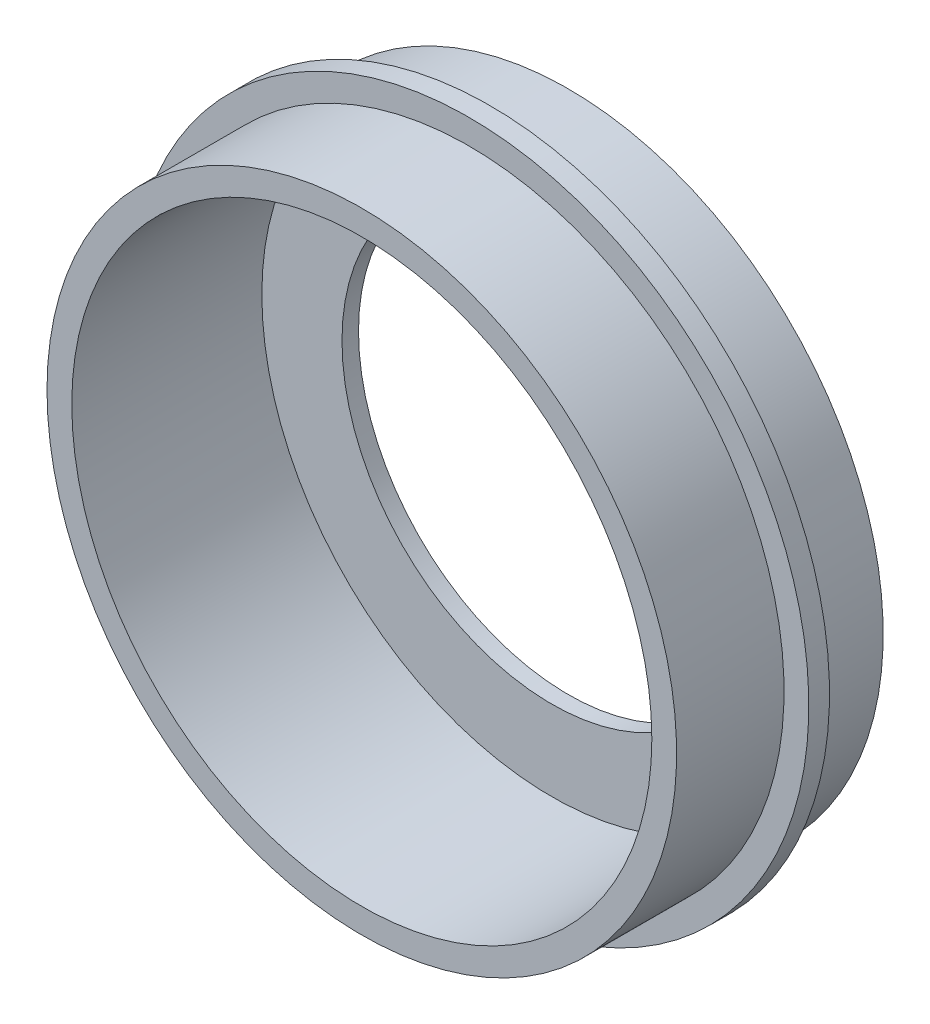
ISO-10303-21;
HEADER;
FILE_DESCRIPTION(('STEP AP214'),'2;1');
FILE_NAME('part.step','',(''),(''),'','','');
FILE_SCHEMA(('AUTOMOTIVE_DESIGN { 1 0 10303 214 1 1 1 1 }'));
ENDSEC;
DATA;
#1=APPLICATION_CONTEXT('core data for automotive mechanical design processes');
#2=APPLICATION_PROTOCOL_DEFINITION('international standard','automotive_design',2000,#1);
#3=PRODUCT_CONTEXT('',#1,'mechanical');
#4=PRODUCT('Part','Part','',(#3));
#5=PRODUCT_RELATED_PRODUCT_CATEGORY('part','',(#4));
#6=PRODUCT_DEFINITION_FORMATION('','',#4);
#7=PRODUCT_DEFINITION_CONTEXT('part definition',#1,'design');
#8=PRODUCT_DEFINITION('design','',#6,#7);
#9=PRODUCT_DEFINITION_SHAPE('','',#8);
#10=(LENGTH_UNIT() NAMED_UNIT(*) SI_UNIT(.MILLI.,.METRE.));
#11=(NAMED_UNIT(*) PLANE_ANGLE_UNIT() SI_UNIT($,.RADIAN.));
#12=(NAMED_UNIT(*) SI_UNIT($,.STERADIAN.) SOLID_ANGLE_UNIT());
#13=UNCERTAINTY_MEASURE_WITH_UNIT(LENGTH_MEASURE(1.E-05),#10,'distance_accuracy_value','');
#14=(GEOMETRIC_REPRESENTATION_CONTEXT(3) GLOBAL_UNCERTAINTY_ASSIGNED_CONTEXT((#13)) GLOBAL_UNIT_ASSIGNED_CONTEXT((#10,
#11,#12)) REPRESENTATION_CONTEXT('',''));
#15=CARTESIAN_POINT('',(0.,0.,0.));
#16=DIRECTION('',(0.,0.,1.));
#17=DIRECTION('',(1.,0.,0.));
#18=AXIS2_PLACEMENT_3D('',#15,#16,#17);
#19=CARTESIAN_POINT('',(0.,0.,0.));
#20=DIRECTION('',(0.,0.,-1.));
#21=DIRECTION('',(-1.,0.,0.));
#22=AXIS2_PLACEMENT_3D('',#19,#20,#21);
#23=CYLINDRICAL_SURFACE('',#22,38.1);
#24=CARTESIAN_POINT('',(0.,0.,25.));
#25=DIRECTION('',(0.,0.,-1.));
#26=DIRECTION('',(-1.,0.,0.));
#27=AXIS2_PLACEMENT_3D('',#24,#25,#26);
#28=CIRCLE('',#27,38.1);
#29=CARTESIAN_POINT('',(-38.1,0.,25.));
#30=VERTEX_POINT('',#29);
#31=EDGE_CURVE('E10',#30,#30,#28,.T.);
#32=ORIENTED_EDGE('',*,*,#31,.T.);
#33=EDGE_LOOP('',(#32));
#34=FACE_BOUND('',#33,.T.);
#35=CARTESIAN_POINT('',(0.,0.,12.));
#36=DIRECTION('',(0.,0.,-1.));
#37=DIRECTION('',(-1.,0.,0.));
#38=AXIS2_PLACEMENT_3D('',#35,#36,#37);
#39=CIRCLE('',#38,38.1);
#40=CARTESIAN_POINT('',(-38.1,0.,12.));
#41=VERTEX_POINT('',#40);
#42=EDGE_CURVE('E84',#41,#41,#39,.T.);
#43=ORIENTED_EDGE('',*,*,#42,.F.);
#44=EDGE_LOOP('',(#43));
#45=FACE_BOUND('',#44,.T.);
#46=ADVANCED_FACE('F41',(#34,#45),#23,.T.);
#47=CARTESIAN_POINT('',(0.,35.1,25.));
#48=DIRECTION('',(0.,0.,1.));
#49=DIRECTION('',(1.,0.,0.));
#50=AXIS2_PLACEMENT_3D('',#47,#48,#49);
#51=PLANE('',#50);
#52=CARTESIAN_POINT('',(0.,0.,25.));
#53=DIRECTION('',(0.,0.,-1.));
#54=DIRECTION('',(-1.,0.,0.));
#55=AXIS2_PLACEMENT_3D('',#52,#53,#54);
#56=CIRCLE('',#55,35.1);
#57=CARTESIAN_POINT('',(-35.1,0.,25.));
#58=VERTEX_POINT('',#57);
#59=EDGE_CURVE('E48',#58,#58,#56,.T.);
#60=ORIENTED_EDGE('',*,*,#59,.T.);
#61=EDGE_LOOP('',(#60));
#62=FACE_BOUND('',#61,.T.);
#63=ORIENTED_EDGE('',*,*,#31,.F.);
#64=EDGE_LOOP('',(#63));
#65=FACE_BOUND('',#64,.T.);
#66=ADVANCED_FACE('F93',(#62,#65),#51,.T.);
#67=CARTESIAN_POINT('',(0.,0.,0.));
#68=DIRECTION('',(0.,0.,-1.));
#69=DIRECTION('',(-1.,0.,0.));
#70=AXIS2_PLACEMENT_3D('',#67,#68,#69);
#71=CYLINDRICAL_SURFACE('',#70,35.1);
#72=CARTESIAN_POINT('',(0.,0.,2.));
#73=DIRECTION('',(0.,0.,-1.));
#74=DIRECTION('',(-1.,0.,0.));
#75=AXIS2_PLACEMENT_3D('',#72,#73,#74);
#76=CIRCLE('',#75,35.1);
#77=CARTESIAN_POINT('',(-35.1,0.,2.));
#78=VERTEX_POINT('',#77);
#79=EDGE_CURVE('E53',#78,#78,#76,.T.);
#80=ORIENTED_EDGE('',*,*,#79,.T.);
#81=EDGE_LOOP('',(#80));
#82=FACE_BOUND('',#81,.T.);
#83=ORIENTED_EDGE('',*,*,#59,.F.);
#84=EDGE_LOOP('',(#83));
#85=FACE_BOUND('',#84,.T.);
#86=ADVANCED_FACE('F97',(#82,#85),#71,.F.);
#87=CARTESIAN_POINT('',(0.,25.4,2.));
#88=DIRECTION('',(0.,0.,1.));
#89=DIRECTION('',(1.,0.,0.));
#90=AXIS2_PLACEMENT_3D('',#87,#88,#89);
#91=PLANE('',#90);
#92=CARTESIAN_POINT('',(0.,0.,2.));
#93=DIRECTION('',(0.,0.,-1.));
#94=DIRECTION('',(-1.,0.,0.));
#95=AXIS2_PLACEMENT_3D('',#92,#93,#94);
#96=CIRCLE('',#95,25.4);
#97=CARTESIAN_POINT('',(-25.4,0.,2.));
#98=VERTEX_POINT('',#97);
#99=EDGE_CURVE('E58',#98,#98,#96,.T.);
#100=ORIENTED_EDGE('',*,*,#99,.T.);
#101=EDGE_LOOP('',(#100));
#102=FACE_BOUND('',#101,.T.);
#103=ORIENTED_EDGE('',*,*,#79,.F.);
#104=EDGE_LOOP('',(#103));
#105=FACE_BOUND('',#104,.T.);
#106=ADVANCED_FACE('F101',(#102,#105),#91,.T.);
#107=CARTESIAN_POINT('',(0.,0.,0.));
#108=DIRECTION('',(0.,0.,-1.));
#109=DIRECTION('',(-1.,0.,0.));
#110=AXIS2_PLACEMENT_3D('',#107,#108,#109);
#111=CYLINDRICAL_SURFACE('',#110,25.4);
#112=CARTESIAN_POINT('',(0.,0.,0.));
#113=DIRECTION('',(0.,0.,-1.));
#114=DIRECTION('',(-1.,0.,0.));
#115=AXIS2_PLACEMENT_3D('',#112,#113,#114);
#116=CIRCLE('',#115,25.4);
#117=CARTESIAN_POINT('',(-25.4,0.,0.));
#118=VERTEX_POINT('',#117);
#119=EDGE_CURVE('E64',#118,#118,#116,.T.);
#120=ORIENTED_EDGE('',*,*,#119,.T.);
#121=EDGE_LOOP('',(#120));
#122=FACE_BOUND('',#121,.T.);
#123=ORIENTED_EDGE('',*,*,#99,.F.);
#124=EDGE_LOOP('',(#123));
#125=FACE_BOUND('',#124,.T.);
#126=ADVANCED_FACE('F108',(#122,#125),#111,.F.);
#127=CARTESIAN_POINT('',(0.,38.1,0.));
#128=DIRECTION('',(0.,0.,-1.));
#129=DIRECTION('',(-1.,0.,0.));
#130=AXIS2_PLACEMENT_3D('',#127,#128,#129);
#131=PLANE('',#130);
#132=CARTESIAN_POINT('',(0.,0.,0.));
#133=DIRECTION('',(0.,0.,-1.));
#134=DIRECTION('',(-1.,0.,0.));
#135=AXIS2_PLACEMENT_3D('',#132,#133,#134);
#136=CIRCLE('',#135,38.1);
#137=CARTESIAN_POINT('',(-38.1,0.,0.));
#138=VERTEX_POINT('',#137);
#139=EDGE_CURVE('E68',#138,#138,#136,.T.);
#140=ORIENTED_EDGE('',*,*,#139,.T.);
#141=EDGE_LOOP('',(#140));
#142=FACE_BOUND('',#141,.T.);
#143=ORIENTED_EDGE('',*,*,#119,.F.);
#144=EDGE_LOOP('',(#143));
#145=FACE_BOUND('',#144,.T.);
#146=ADVANCED_FACE('F112',(#142,#145),#131,.T.);
#147=CARTESIAN_POINT('',(0.,0.,0.));
#148=DIRECTION('',(0.,0.,-1.));
#149=DIRECTION('',(-1.,0.,0.));
#150=AXIS2_PLACEMENT_3D('',#147,#148,#149);
#151=CYLINDRICAL_SURFACE('',#150,38.1);
#152=CARTESIAN_POINT('',(0.,0.,9.5));
#153=DIRECTION('',(0.,0.,-1.));
#154=DIRECTION('',(-1.,0.,0.));
#155=AXIS2_PLACEMENT_3D('',#152,#153,#154);
#156=CIRCLE('',#155,38.1);
#157=CARTESIAN_POINT('',(-38.1,0.,9.5));
#158=VERTEX_POINT('',#157);
#159=EDGE_CURVE('E72',#158,#158,#156,.T.);
#160=ORIENTED_EDGE('',*,*,#159,.T.);
#161=EDGE_LOOP('',(#160));
#162=FACE_BOUND('',#161,.T.);
#163=ORIENTED_EDGE('',*,*,#139,.F.);
#164=EDGE_LOOP('',(#163));
#165=FACE_BOUND('',#164,.T.);
#166=ADVANCED_FACE('F116',(#162,#165),#151,.T.);
#167=CARTESIAN_POINT('',(0.,41.1,9.5));
#168=DIRECTION('',(0.,0.,-1.));
#169=DIRECTION('',(-1.,0.,0.));
#170=AXIS2_PLACEMENT_3D('',#167,#168,#169);
#171=PLANE('',#170);
#172=CARTESIAN_POINT('',(0.,0.,9.5));
#173=DIRECTION('',(0.,0.,-1.));
#174=DIRECTION('',(-1.,0.,0.));
#175=AXIS2_PLACEMENT_3D('',#172,#173,#174);
#176=CIRCLE('',#175,41.1);
#177=CARTESIAN_POINT('',(-41.1,0.,9.5));
#178=VERTEX_POINT('',#177);
#179=EDGE_CURVE('E76',#178,#178,#176,.T.);
#180=ORIENTED_EDGE('',*,*,#179,.T.);
#181=EDGE_LOOP('',(#180));
#182=FACE_BOUND('',#181,.T.);
#183=ORIENTED_EDGE('',*,*,#159,.F.);
#184=EDGE_LOOP('',(#183));
#185=FACE_BOUND('',#184,.T.);
#186=ADVANCED_FACE('F120',(#182,#185),#171,.T.);
#187=CARTESIAN_POINT('',(0.,0.,0.));
#188=DIRECTION('',(0.,0.,-1.));
#189=DIRECTION('',(-1.,0.,0.));
#190=AXIS2_PLACEMENT_3D('',#187,#188,#189);
#191=CYLINDRICAL_SURFACE('',#190,41.1);
#192=CARTESIAN_POINT('',(0.,0.,12.));
#193=DIRECTION('',(0.,0.,-1.));
#194=DIRECTION('',(-1.,0.,0.));
#195=AXIS2_PLACEMENT_3D('',#192,#193,#194);
#196=CIRCLE('',#195,41.1);
#197=CARTESIAN_POINT('',(-41.1,0.,12.));
#198=VERTEX_POINT('',#197);
#199=EDGE_CURVE('E80',#198,#198,#196,.T.);
#200=ORIENTED_EDGE('',*,*,#199,.T.);
#201=EDGE_LOOP('',(#200));
#202=FACE_BOUND('',#201,.T.);
#203=ORIENTED_EDGE('',*,*,#179,.F.);
#204=EDGE_LOOP('',(#203));
#205=FACE_BOUND('',#204,.T.);
#206=ADVANCED_FACE('F124',(#202,#205),#191,.T.);
#207=CARTESIAN_POINT('',(0.,38.1,12.));
#208=DIRECTION('',(0.,0.,1.));
#209=DIRECTION('',(1.,0.,0.));
#210=AXIS2_PLACEMENT_3D('',#207,#208,#209);
#211=PLANE('',#210);
#212=ORIENTED_EDGE('',*,*,#42,.T.);
#213=EDGE_LOOP('',(#212));
#214=FACE_BOUND('',#213,.T.);
#215=ORIENTED_EDGE('',*,*,#199,.F.);
#216=EDGE_LOOP('',(#215));
#217=FACE_BOUND('',#216,.T.);
#218=ADVANCED_FACE('F89',(#214,#217),#211,.T.);
#219=CLOSED_SHELL('',(#46,#66,#86,#106,#126,#146,#166,#186,#206,#218));
#220=MANIFOLD_SOLID_BREP('B2',#219);
#221=ADVANCED_BREP_SHAPE_REPRESENTATION('',(#18,#220),#14);
#222=SHAPE_DEFINITION_REPRESENTATION(#9,#221);
ENDSEC;
END-ISO-10303-21;
